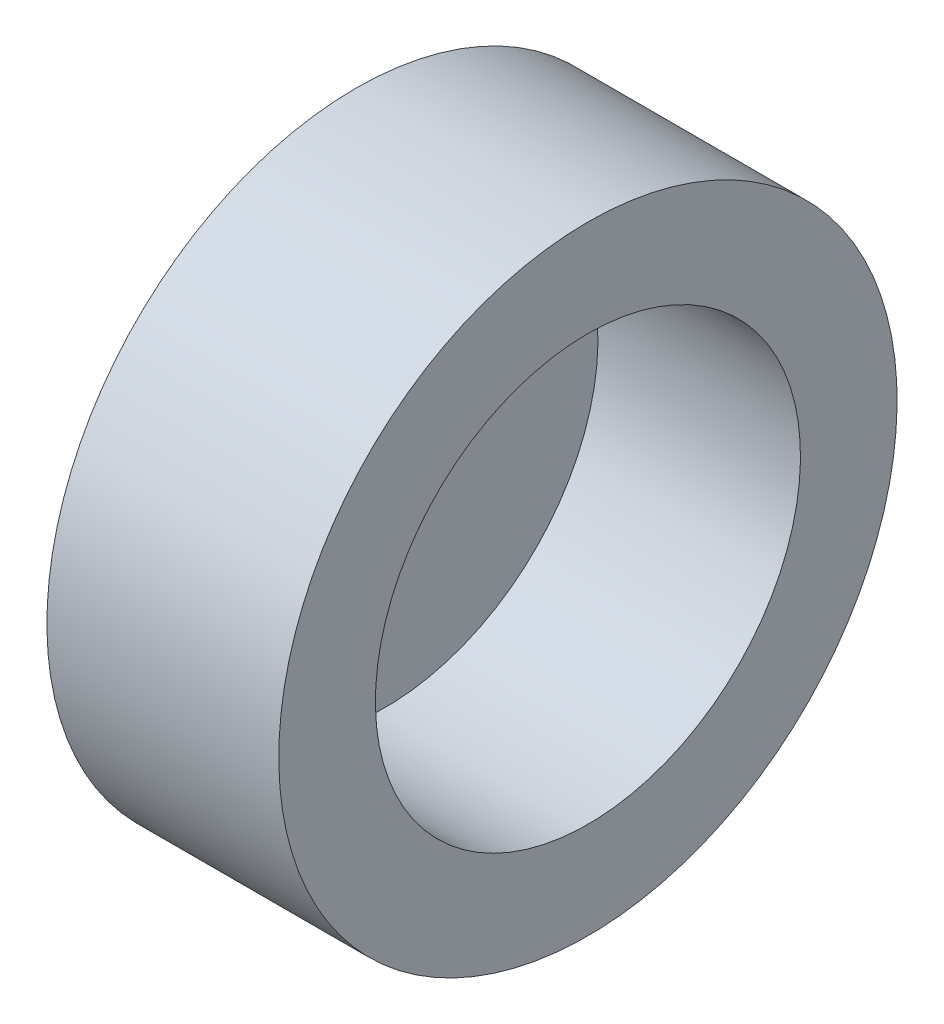
ISO-10303-21;
HEADER;
FILE_DESCRIPTION(('STEP AP214'),'2;1');
FILE_NAME('part.step','',(''),(''),'','','');
FILE_SCHEMA(('AUTOMOTIVE_DESIGN { 1 0 10303 214 1 1 1 1 }'));
ENDSEC;
DATA;
#1=APPLICATION_CONTEXT('core data for automotive mechanical design processes');
#2=APPLICATION_PROTOCOL_DEFINITION('international standard','automotive_design',2000,#1);
#3=PRODUCT_CONTEXT('',#1,'mechanical');
#4=PRODUCT('Part','Part','',(#3));
#5=PRODUCT_RELATED_PRODUCT_CATEGORY('part','',(#4));
#6=PRODUCT_DEFINITION_FORMATION('','',#4);
#7=PRODUCT_DEFINITION_CONTEXT('part definition',#1,'design');
#8=PRODUCT_DEFINITION('design','',#6,#7);
#9=PRODUCT_DEFINITION_SHAPE('','',#8);
#10=(LENGTH_UNIT() NAMED_UNIT(*) SI_UNIT(.MILLI.,.METRE.));
#11=(NAMED_UNIT(*) PLANE_ANGLE_UNIT() SI_UNIT($,.RADIAN.));
#12=(NAMED_UNIT(*) SI_UNIT($,.STERADIAN.) SOLID_ANGLE_UNIT());
#13=UNCERTAINTY_MEASURE_WITH_UNIT(LENGTH_MEASURE(1.E-05),#10,'distance_accuracy_value','');
#14=(GEOMETRIC_REPRESENTATION_CONTEXT(3) GLOBAL_UNCERTAINTY_ASSIGNED_CONTEXT((#13)) GLOBAL_UNIT_ASSIGNED_CONTEXT((#10,
#11,#12)) REPRESENTATION_CONTEXT('',''));
#15=CARTESIAN_POINT('',(0.,0.,0.));
#16=DIRECTION('',(0.,0.,1.));
#17=DIRECTION('',(1.,0.,0.));
#18=AXIS2_PLACEMENT_3D('',#15,#16,#17);
#19=CARTESIAN_POINT('',(9.,16.1957961271069,0.));
#20=DIRECTION('',(1.,0.,0.));
#21=DIRECTION('',(0.,1.,0.));
#22=AXIS2_PLACEMENT_3D('',#19,#20,#21);
#23=PLANE('',#22);
#24=CARTESIAN_POINT('',(9.,0.195796127106932,0.));
#25=DIRECTION('',(1.,0.,0.));
#26=DIRECTION('',(0.,1.,0.));
#27=AXIS2_PLACEMENT_3D('',#24,#25,#26);
#28=CIRCLE('',#27,16.);
#29=CARTESIAN_POINT('',(9.,16.1957961271069,0.));
#30=VERTEX_POINT('',#29);
#31=EDGE_CURVE('E59',#30,#30,#28,.T.);
#32=ORIENTED_EDGE('',*,*,#31,.T.);
#33=EDGE_LOOP('',(#32));
#34=FACE_BOUND('',#33,.T.);
#35=CARTESIAN_POINT('',(9.00000000000001,0.195796127106932,0.));
#36=DIRECTION('',(1.,0.,0.));
#37=DIRECTION('',(0.,1.,0.));
#38=AXIS2_PLACEMENT_3D('',#35,#36,#37);
#39=CIRCLE('',#38,11.);
#40=CARTESIAN_POINT('',(9.,11.1957961271069,0.));
#41=VERTEX_POINT('',#40);
#42=EDGE_CURVE('E10',#41,#41,#39,.T.);
#43=ORIENTED_EDGE('',*,*,#42,.F.);
#44=EDGE_LOOP('',(#43));
#45=FACE_BOUND('',#44,.T.);
#46=ADVANCED_FACE('F31',(#34,#45),#23,.T.);
#47=CARTESIAN_POINT('',(0.,0.195796127106931,0.));
#48=DIRECTION('',(1.,0.,0.));
#49=DIRECTION('',(0.,1.,0.));
#50=AXIS2_PLACEMENT_3D('',#47,#48,#49);
#51=CYLINDRICAL_SURFACE('',#50,11.);
#52=ORIENTED_EDGE('',*,*,#42,.T.);
#53=EDGE_LOOP('',(#52));
#54=FACE_BOUND('',#53,.T.);
#55=CARTESIAN_POINT('',(-1.48098042782424,0.195796127106931,0.));
#56=DIRECTION('',(1.,0.,0.));
#57=DIRECTION('',(0.,1.,0.));
#58=AXIS2_PLACEMENT_3D('',#55,#56,#57);
#59=CIRCLE('',#58,11.);
#60=CARTESIAN_POINT('',(-1.48098042782424,11.1957961271069,0.));
#61=VERTEX_POINT('',#60);
#62=EDGE_CURVE('E37',#61,#61,#59,.T.);
#63=ORIENTED_EDGE('',*,*,#62,.F.);
#64=EDGE_LOOP('',(#63));
#65=FACE_BOUND('',#64,.T.);
#66=ADVANCED_FACE('F77',(#54,#65),#51,.F.);
#67=CARTESIAN_POINT('',(-1.48098042782424,11.1957961271069,0.));
#68=DIRECTION('',(1.,0.,0.));
#69=DIRECTION('',(0.,1.,0.));
#70=AXIS2_PLACEMENT_3D('',#67,#68,#69);
#71=PLANE('',#70);
#72=ORIENTED_EDGE('',*,*,#62,.T.);
#73=EDGE_LOOP('',(#72));
#74=FACE_BOUND('',#73,.T.);
#75=CARTESIAN_POINT('',(-1.48098042782424,0.195796127106931,0.));
#76=DIRECTION('',(1.,0.,0.));
#77=DIRECTION('',(0.,1.,0.));
#78=AXIS2_PLACEMENT_3D('',#75,#76,#77);
#79=CIRCLE('',#78,1.80420387289307);
#80=CARTESIAN_POINT('',(-1.48098042782424,2.,0.));
#81=VERTEX_POINT('',#80);
#82=EDGE_CURVE('E41',#81,#81,#79,.T.);
#83=ORIENTED_EDGE('',*,*,#82,.F.);
#84=EDGE_LOOP('',(#83));
#85=FACE_BOUND('',#84,.T.);
#86=ADVANCED_FACE('F81',(#74,#85),#71,.T.);
#87=CARTESIAN_POINT('',(0.,0.195796127106931,0.));
#88=DIRECTION('',(1.,0.,0.));
#89=DIRECTION('',(0.,1.,0.));
#90=AXIS2_PLACEMENT_3D('',#87,#88,#89);
#91=CYLINDRICAL_SURFACE('',#90,1.80420387289307);
#92=ORIENTED_EDGE('',*,*,#82,.T.);
#93=EDGE_LOOP('',(#92));
#94=FACE_BOUND('',#93,.T.);
#95=CARTESIAN_POINT('',(-8.48098042782424,0.19579612710693,0.));
#96=DIRECTION('',(1.,0.,0.));
#97=DIRECTION('',(0.,1.,0.));
#98=AXIS2_PLACEMENT_3D('',#95,#96,#97);
#99=CIRCLE('',#98,1.80420387289307);
#100=CARTESIAN_POINT('',(-8.48098042782424,2.,0.));
#101=VERTEX_POINT('',#100);
#102=EDGE_CURVE('E45',#101,#101,#99,.T.);
#103=ORIENTED_EDGE('',*,*,#102,.F.);
#104=EDGE_LOOP('',(#103));
#105=FACE_BOUND('',#104,.T.);
#106=ADVANCED_FACE('F85',(#94,#105),#91,.F.);
#107=CARTESIAN_POINT('',(-8.48098042782424,5.,0.));
#108=DIRECTION('',(-1.,0.,0.));
#109=DIRECTION('',(0.,-1.,0.));
#110=AXIS2_PLACEMENT_3D('',#107,#108,#109);
#111=PLANE('',#110);
#112=ORIENTED_EDGE('',*,*,#102,.T.);
#113=EDGE_LOOP('',(#112));
#114=FACE_BOUND('',#113,.T.);
#115=CARTESIAN_POINT('',(-8.48098042782424,0.19579612710693,0.));
#116=DIRECTION('',(1.,0.,0.));
#117=DIRECTION('',(0.,1.,0.));
#118=AXIS2_PLACEMENT_3D('',#115,#116,#117);
#119=CIRCLE('',#118,4.80420387289307);
#120=CARTESIAN_POINT('',(-8.48098042782424,5.,0.));
#121=VERTEX_POINT('',#120);
#122=EDGE_CURVE('E50',#121,#121,#119,.T.);
#123=ORIENTED_EDGE('',*,*,#122,.F.);
#124=EDGE_LOOP('',(#123));
#125=FACE_BOUND('',#124,.T.);
#126=ADVANCED_FACE('F91',(#114,#125),#111,.T.);
#127=CARTESIAN_POINT('',(0.,0.195796127106931,0.));
#128=DIRECTION('',(1.,0.,0.));
#129=DIRECTION('',(0.,1.,0.));
#130=AXIS2_PLACEMENT_3D('',#127,#128,#129);
#131=CYLINDRICAL_SURFACE('',#130,4.80420387289307);
#132=ORIENTED_EDGE('',*,*,#122,.T.);
#133=EDGE_LOOP('',(#132));
#134=FACE_BOUND('',#133,.T.);
#135=CARTESIAN_POINT('',(-3.,0.19579612710693,0.));
#136=DIRECTION('',(1.,0.,0.));
#137=DIRECTION('',(0.,1.,0.));
#138=AXIS2_PLACEMENT_3D('',#135,#136,#137);
#139=CIRCLE('',#138,4.80420387289307);
#140=CARTESIAN_POINT('',(-3.,5.,0.));
#141=VERTEX_POINT('',#140);
#142=EDGE_CURVE('E53',#141,#141,#139,.T.);
#143=ORIENTED_EDGE('',*,*,#142,.F.);
#144=EDGE_LOOP('',(#143));
#145=FACE_BOUND('',#144,.T.);
#146=ADVANCED_FACE('F73',(#134,#145),#131,.T.);
#147=CARTESIAN_POINT('',(-3.,5.,0.));
#148=DIRECTION('',(-1.,0.,0.));
#149=DIRECTION('',(0.,-1.,0.));
#150=AXIS2_PLACEMENT_3D('',#147,#148,#149);
#151=PLANE('',#150);
#152=ORIENTED_EDGE('',*,*,#142,.T.);
#153=EDGE_LOOP('',(#152));
#154=FACE_BOUND('',#153,.T.);
#155=CARTESIAN_POINT('',(-3.,0.19579612710693,0.));
#156=DIRECTION('',(1.,0.,0.));
#157=DIRECTION('',(0.,1.,0.));
#158=AXIS2_PLACEMENT_3D('',#155,#156,#157);
#159=CIRCLE('',#158,16.);
#160=CARTESIAN_POINT('',(-3.,16.1957961271069,0.));
#161=VERTEX_POINT('',#160);
#162=EDGE_CURVE('E56',#161,#161,#159,.T.);
#163=ORIENTED_EDGE('',*,*,#162,.F.);
#164=EDGE_LOOP('',(#163));
#165=FACE_BOUND('',#164,.T.);
#166=ADVANCED_FACE('F67',(#154,#165),#151,.T.);
#167=CARTESIAN_POINT('',(0.,0.195796127106931,0.));
#168=DIRECTION('',(1.,0.,0.));
#169=DIRECTION('',(0.,1.,0.));
#170=AXIS2_PLACEMENT_3D('',#167,#168,#169);
#171=CYLINDRICAL_SURFACE('',#170,16.);
#172=ORIENTED_EDGE('',*,*,#162,.T.);
#173=EDGE_LOOP('',(#172));
#174=FACE_BOUND('',#173,.T.);
#175=ORIENTED_EDGE('',*,*,#31,.F.);
#176=EDGE_LOOP('',(#175));
#177=FACE_BOUND('',#176,.T.);
#178=ADVANCED_FACE('F65',(#174,#177),#171,.T.);
#179=CLOSED_SHELL('',(#46,#66,#86,#106,#126,#146,#166,#178));
#180=MANIFOLD_SOLID_BREP('B2',#179);
#181=ADVANCED_BREP_SHAPE_REPRESENTATION('',(#18,#180),#14);
#182=SHAPE_DEFINITION_REPRESENTATION(#9,#181);
ENDSEC;
END-ISO-10303-21;
